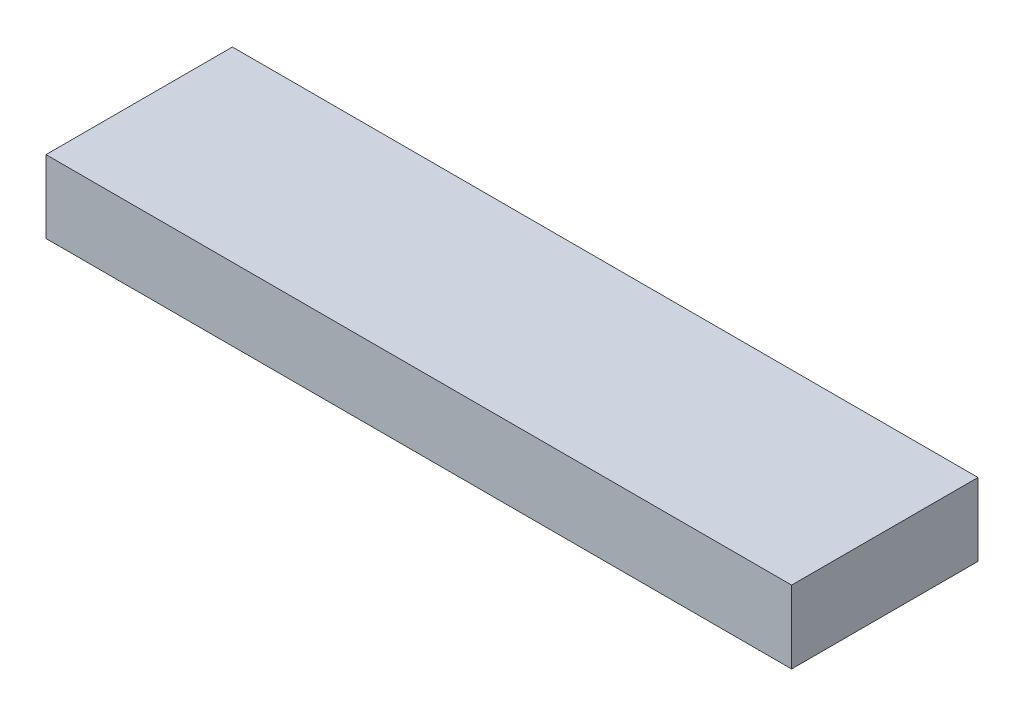
ISO-10303-21;
HEADER;
FILE_DESCRIPTION(('STEP AP214'),'2;1');
FILE_NAME('part.step','',(''),(''),'','','');
FILE_SCHEMA(('AUTOMOTIVE_DESIGN { 1 0 10303 214 1 1 1 1 }'));
ENDSEC;
DATA;
#1=APPLICATION_CONTEXT('core data for automotive mechanical design processes');
#2=APPLICATION_PROTOCOL_DEFINITION('international standard','automotive_design',2000,#1);
#3=PRODUCT_CONTEXT('',#1,'mechanical');
#4=PRODUCT('Part','Part','',(#3));
#5=PRODUCT_RELATED_PRODUCT_CATEGORY('part','',(#4));
#6=PRODUCT_DEFINITION_FORMATION('','',#4);
#7=PRODUCT_DEFINITION_CONTEXT('part definition',#1,'design');
#8=PRODUCT_DEFINITION('design','',#6,#7);
#9=PRODUCT_DEFINITION_SHAPE('','',#8);
#10=(LENGTH_UNIT() NAMED_UNIT(*) SI_UNIT(.MILLI.,.METRE.));
#11=(NAMED_UNIT(*) PLANE_ANGLE_UNIT() SI_UNIT($,.RADIAN.));
#12=(NAMED_UNIT(*) SI_UNIT($,.STERADIAN.) SOLID_ANGLE_UNIT());
#13=UNCERTAINTY_MEASURE_WITH_UNIT(LENGTH_MEASURE(1.E-05),#10,'distance_accuracy_value','');
#14=(GEOMETRIC_REPRESENTATION_CONTEXT(3) GLOBAL_UNCERTAINTY_ASSIGNED_CONTEXT((#13)) GLOBAL_UNIT_ASSIGNED_CONTEXT((#10,
#11,#12)) REPRESENTATION_CONTEXT('',''));
#15=CARTESIAN_POINT('',(0.,0.,0.));
#16=DIRECTION('',(0.,0.,1.));
#17=DIRECTION('',(1.,0.,0.));
#18=AXIS2_PLACEMENT_3D('',#15,#16,#17);
#19=CARTESIAN_POINT('',(-52.1227343115316,3.1,-15.1489720412826));
#20=DIRECTION('',(1.,0.,0.));
#21=DIRECTION('',(0.,0.,-1.));
#22=AXIS2_PLACEMENT_3D('',#19,#20,#21);
#23=PLANE('',#22);
#24=DIRECTION('',(0.,0.,1.));
#25=VECTOR('',#24,1.);
#26=CARTESIAN_POINT('',(-52.1227343115316,0.,-15.1489720412826));
#27=LINE('',#26,#25);
#28=CARTESIAN_POINT('',(-52.1227343115316,0.,-15.1489720412826));
#29=VERTEX_POINT('',#28);
#30=CARTESIAN_POINT('',(-52.1227343115316,0.,-7.19897204128258));
#31=VERTEX_POINT('',#30);
#32=EDGE_CURVE('E140',#29,#31,#27,.T.);
#33=ORIENTED_EDGE('',*,*,#32,.T.);
#34=DIRECTION('',(0.,-1.,0.));
#35=VECTOR('',#34,1.);
#36=CARTESIAN_POINT('',(-52.1227343115316,3.1,-7.19897204128258));
#37=LINE('',#36,#35);
#38=CARTESIAN_POINT('',(-52.1227343115316,3.1,-7.19897204128258));
#39=VERTEX_POINT('',#38);
#40=EDGE_CURVE('E11',#39,#31,#37,.T.);
#41=ORIENTED_EDGE('',*,*,#40,.F.);
#42=DIRECTION('',(0.,0.,1.));
#43=VECTOR('',#42,1.);
#44=CARTESIAN_POINT('',(-52.1227343115316,3.1,-15.1489720412826));
#45=LINE('',#44,#43);
#46=CARTESIAN_POINT('',(-52.1227343115316,3.1,-15.1489720412826));
#47=VERTEX_POINT('',#46);
#48=EDGE_CURVE('E144',#47,#39,#45,.T.);
#49=ORIENTED_EDGE('',*,*,#48,.F.);
#50=DIRECTION('',(0.,-1.,0.));
#51=VECTOR('',#50,1.);
#52=CARTESIAN_POINT('',(-52.1227343115316,3.1,-15.1489720412826));
#53=LINE('',#52,#51);
#54=EDGE_CURVE('E150',#47,#29,#53,.T.);
#55=ORIENTED_EDGE('',*,*,#54,.T.);
#56=EDGE_LOOP('',(#33,#41,#49,#55));
#57=FACE_BOUND('',#56,.T.);
#58=ADVANCED_FACE('F32',(#57),#23,.F.);
#59=CARTESIAN_POINT('',(-20.3227343115316,3.1,-7.19897204128259));
#60=DIRECTION('',(0.,0.,-1.));
#61=DIRECTION('',(-1.,0.,0.));
#62=AXIS2_PLACEMENT_3D('',#59,#60,#61);
#63=PLANE('',#62);
#64=DIRECTION('',(1.,0.,0.));
#65=VECTOR('',#64,1.);
#66=CARTESIAN_POINT('',(-20.3227343115316,0.,-7.19897204128259));
#67=LINE('',#66,#65);
#68=CARTESIAN_POINT('',(-20.3227343115316,0.,-7.19897204128259));
#69=VERTEX_POINT('',#68);
#70=EDGE_CURVE('E153',#31,#69,#67,.T.);
#71=ORIENTED_EDGE('',*,*,#70,.T.);
#72=DIRECTION('',(0.,-1.,0.));
#73=VECTOR('',#72,1.);
#74=CARTESIAN_POINT('',(-20.3227343115316,3.1,-7.19897204128259));
#75=LINE('',#74,#73);
#76=CARTESIAN_POINT('',(-20.3227343115316,3.1,-7.19897204128259));
#77=VERTEX_POINT('',#76);
#78=EDGE_CURVE('E39',#77,#69,#75,.T.);
#79=ORIENTED_EDGE('',*,*,#78,.F.);
#80=DIRECTION('',(1.,0.,0.));
#81=VECTOR('',#80,1.);
#82=CARTESIAN_POINT('',(-20.3227343115316,3.1,-7.19897204128259));
#83=LINE('',#82,#81);
#84=EDGE_CURVE('E83',#39,#77,#83,.T.);
#85=ORIENTED_EDGE('',*,*,#84,.F.);
#86=ORIENTED_EDGE('',*,*,#40,.T.);
#87=EDGE_LOOP('',(#71,#79,#85,#86));
#88=FACE_BOUND('',#87,.T.);
#89=ADVANCED_FACE('F181',(#88),#63,.F.);
#90=CARTESIAN_POINT('',(-20.3227343115316,3.1,-15.1489720412826));
#91=DIRECTION('',(-1.,0.,0.));
#92=DIRECTION('',(0.,0.,1.));
#93=AXIS2_PLACEMENT_3D('',#90,#91,#92);
#94=PLANE('',#93);
#95=DIRECTION('',(0.,0.,-1.));
#96=VECTOR('',#95,1.);
#97=CARTESIAN_POINT('',(-20.3227343115316,0.,-15.1489720412826));
#98=LINE('',#97,#96);
#99=CARTESIAN_POINT('',(-20.3227343115316,0.,-15.1489720412826));
#100=VERTEX_POINT('',#99);
#101=EDGE_CURVE('E155',#69,#100,#98,.T.);
#102=ORIENTED_EDGE('',*,*,#101,.T.);
#103=DIRECTION('',(0.,-1.,0.));
#104=VECTOR('',#103,1.);
#105=CARTESIAN_POINT('',(-20.3227343115316,3.1,-15.1489720412826));
#106=LINE('',#105,#104);
#107=CARTESIAN_POINT('',(-20.3227343115316,3.1,-15.1489720412826));
#108=VERTEX_POINT('',#107);
#109=EDGE_CURVE('E159',#108,#100,#106,.T.);
#110=ORIENTED_EDGE('',*,*,#109,.F.);
#111=DIRECTION('',(0.,0.,-1.));
#112=VECTOR('',#111,1.);
#113=CARTESIAN_POINT('',(-20.3227343115316,3.1,-15.1489720412826));
#114=LINE('',#113,#112);
#115=EDGE_CURVE('E147',#77,#108,#114,.T.);
#116=ORIENTED_EDGE('',*,*,#115,.F.);
#117=ORIENTED_EDGE('',*,*,#78,.T.);
#118=EDGE_LOOP('',(#102,#110,#116,#117));
#119=FACE_BOUND('',#118,.T.);
#120=ADVANCED_FACE('F164',(#119),#94,.F.);
#121=CARTESIAN_POINT('',(-52.1227343115316,3.1,-15.1489720412826));
#122=DIRECTION('',(0.,0.,1.));
#123=DIRECTION('',(1.,0.,0.));
#124=AXIS2_PLACEMENT_3D('',#121,#122,#123);
#125=PLANE('',#124);
#126=DIRECTION('',(-1.,0.,0.));
#127=VECTOR('',#126,1.);
#128=CARTESIAN_POINT('',(-52.1227343115316,0.,-15.1489720412826));
#129=LINE('',#128,#127);
#130=EDGE_CURVE('E76',#100,#29,#129,.T.);
#131=ORIENTED_EDGE('',*,*,#130,.T.);
#132=ORIENTED_EDGE('',*,*,#54,.F.);
#133=DIRECTION('',(-1.,0.,0.));
#134=VECTOR('',#133,1.);
#135=CARTESIAN_POINT('',(-52.1227343115316,3.1,-15.1489720412826));
#136=LINE('',#135,#134);
#137=EDGE_CURVE('E55',#108,#47,#136,.T.);
#138=ORIENTED_EDGE('',*,*,#137,.F.);
#139=ORIENTED_EDGE('',*,*,#109,.T.);
#140=EDGE_LOOP('',(#131,#132,#138,#139));
#141=FACE_BOUND('',#140,.T.);
#142=ADVANCED_FACE('F172',(#141),#125,.F.);
#143=CARTESIAN_POINT('',(-52.1227343115316,3.1,-7.19897204128258));
#144=DIRECTION('',(0.,-1.,0.));
#145=DIRECTION('',(0.,0.,-1.));
#146=AXIS2_PLACEMENT_3D('',#143,#144,#145);
#147=PLANE('',#146);
#148=ORIENTED_EDGE('',*,*,#48,.T.);
#149=ORIENTED_EDGE('',*,*,#84,.T.);
#150=ORIENTED_EDGE('',*,*,#115,.T.);
#151=ORIENTED_EDGE('',*,*,#137,.T.);
#152=EDGE_LOOP('',(#148,#149,#150,#151));
#153=FACE_BOUND('',#152,.T.);
#154=ADVANCED_FACE('F174',(#153),#147,.F.);
#155=CARTESIAN_POINT('',(-52.1227343115316,0.,-7.19897204128258));
#156=DIRECTION('',(0.,-1.,0.));
#157=DIRECTION('',(0.,0.,-1.));
#158=AXIS2_PLACEMENT_3D('',#155,#156,#157);
#159=PLANE('',#158);
#160=DIRECTION('',(0.,0.,-1.));
#161=VECTOR('',#160,1.);
#162=CARTESIAN_POINT('',(-50.6227343115316,0.,-13.6489720412826));
#163=LINE('',#162,#161);
#164=CARTESIAN_POINT('',(-50.6227343115316,0.,-8.69897204128258));
#165=VERTEX_POINT('',#164);
#166=CARTESIAN_POINT('',(-50.6227343115316,0.,-13.6489720412826));
#167=VERTEX_POINT('',#166);
#168=EDGE_CURVE('E46',#165,#167,#163,.T.);
#169=ORIENTED_EDGE('',*,*,#168,.F.);
#170=DIRECTION('',(-1.,0.,0.));
#171=VECTOR('',#170,1.);
#172=CARTESIAN_POINT('',(-50.6227343115316,0.,-8.69897204128258));
#173=LINE('',#172,#171);
#174=CARTESIAN_POINT('',(-21.8227343115316,0.,-8.69897204128258));
#175=VERTEX_POINT('',#174);
#176=EDGE_CURVE('E125',#175,#165,#173,.T.);
#177=ORIENTED_EDGE('',*,*,#176,.F.);
#178=DIRECTION('',(0.,0.,1.));
#179=VECTOR('',#178,1.);
#180=CARTESIAN_POINT('',(-21.8227343115316,0.,-8.69897204128258));
#181=LINE('',#180,#179);
#182=CARTESIAN_POINT('',(-21.8227343115316,0.,-13.6489720412826));
#183=VERTEX_POINT('',#182);
#184=EDGE_CURVE('E128',#183,#175,#181,.T.);
#185=ORIENTED_EDGE('',*,*,#184,.F.);
#186=DIRECTION('',(1.,0.,0.));
#187=VECTOR('',#186,1.);
#188=CARTESIAN_POINT('',(-21.8227343115316,0.,-13.6489720412826));
#189=LINE('',#188,#187);
#190=EDGE_CURVE('E134',#167,#183,#189,.T.);
#191=ORIENTED_EDGE('',*,*,#190,.F.);
#192=EDGE_LOOP('',(#169,#177,#185,#191));
#193=FACE_BOUND('',#192,.T.);
#194=ORIENTED_EDGE('',*,*,#32,.F.);
#195=ORIENTED_EDGE('',*,*,#130,.F.);
#196=ORIENTED_EDGE('',*,*,#101,.F.);
#197=ORIENTED_EDGE('',*,*,#70,.F.);
#198=EDGE_LOOP('',(#194,#195,#196,#197));
#199=FACE_BOUND('',#198,.T.);
#200=ADVANCED_FACE('F168',(#193,#199),#159,.T.);
#201=CARTESIAN_POINT('',(-50.6227343115316,2.,-13.6489720412826));
#202=DIRECTION('',(-1.,0.,0.));
#203=DIRECTION('',(0.,0.,1.));
#204=AXIS2_PLACEMENT_3D('',#201,#202,#203);
#205=PLANE('',#204);
#206=ORIENTED_EDGE('',*,*,#168,.T.);
#207=DIRECTION('',(0.,-1.,0.));
#208=VECTOR('',#207,1.);
#209=CARTESIAN_POINT('',(-50.6227343115316,2.,-13.6489720412826));
#210=LINE('',#209,#208);
#211=CARTESIAN_POINT('',(-50.6227343115316,2.,-13.6489720412826));
#212=VERTEX_POINT('',#211);
#213=EDGE_CURVE('E103',#212,#167,#210,.T.);
#214=ORIENTED_EDGE('',*,*,#213,.F.);
#215=DIRECTION('',(0.,0.,-1.));
#216=VECTOR('',#215,1.);
#217=CARTESIAN_POINT('',(-50.6227343115316,2.,-13.6489720412826));
#218=LINE('',#217,#216);
#219=CARTESIAN_POINT('',(-50.6227343115316,2.,-8.69897204128258));
#220=VERTEX_POINT('',#219);
#221=EDGE_CURVE('E107',#220,#212,#218,.T.);
#222=ORIENTED_EDGE('',*,*,#221,.F.);
#223=DIRECTION('',(0.,-1.,0.));
#224=VECTOR('',#223,1.);
#225=CARTESIAN_POINT('',(-50.6227343115316,2.,-8.69897204128258));
#226=LINE('',#225,#224);
#227=EDGE_CURVE('E138',#220,#165,#226,.T.);
#228=ORIENTED_EDGE('',*,*,#227,.T.);
#229=EDGE_LOOP('',(#206,#214,#222,#228));
#230=FACE_BOUND('',#229,.T.);
#231=ADVANCED_FACE('F105',(#230),#205,.F.);
#232=CARTESIAN_POINT('',(-50.6227343115316,2.,-8.69897204128258));
#233=DIRECTION('',(0.,0.,1.));
#234=DIRECTION('',(1.,0.,0.));
#235=AXIS2_PLACEMENT_3D('',#232,#233,#234);
#236=PLANE('',#235);
#237=ORIENTED_EDGE('',*,*,#176,.T.);
#238=ORIENTED_EDGE('',*,*,#227,.F.);
#239=DIRECTION('',(-1.,0.,0.));
#240=VECTOR('',#239,1.);
#241=CARTESIAN_POINT('',(-50.6227343115316,2.,-8.69897204128258));
#242=LINE('',#241,#240);
#243=CARTESIAN_POINT('',(-21.8227343115316,2.,-8.69897204128258));
#244=VERTEX_POINT('',#243);
#245=EDGE_CURVE('E113',#244,#220,#242,.T.);
#246=ORIENTED_EDGE('',*,*,#245,.F.);
#247=DIRECTION('',(0.,-1.,0.));
#248=VECTOR('',#247,1.);
#249=CARTESIAN_POINT('',(-21.8227343115316,2.,-8.69897204128258));
#250=LINE('',#249,#248);
#251=EDGE_CURVE('E141',#244,#175,#250,.T.);
#252=ORIENTED_EDGE('',*,*,#251,.T.);
#253=EDGE_LOOP('',(#237,#238,#246,#252));
#254=FACE_BOUND('',#253,.T.);
#255=ADVANCED_FACE('F221',(#254),#236,.F.);
#256=CARTESIAN_POINT('',(-21.8227343115316,2.,-8.69897204128258));
#257=DIRECTION('',(1.,0.,0.));
#258=DIRECTION('',(0.,0.,-1.));
#259=AXIS2_PLACEMENT_3D('',#256,#257,#258);
#260=PLANE('',#259);
#261=ORIENTED_EDGE('',*,*,#184,.T.);
#262=ORIENTED_EDGE('',*,*,#251,.F.);
#263=DIRECTION('',(0.,0.,1.));
#264=VECTOR('',#263,1.);
#265=CARTESIAN_POINT('',(-21.8227343115316,2.,-8.69897204128258));
#266=LINE('',#265,#264);
#267=CARTESIAN_POINT('',(-21.8227343115316,2.,-13.6489720412826));
#268=VERTEX_POINT('',#267);
#269=EDGE_CURVE('E121',#268,#244,#266,.T.);
#270=ORIENTED_EDGE('',*,*,#269,.F.);
#271=DIRECTION('',(0.,-1.,0.));
#272=VECTOR('',#271,1.);
#273=CARTESIAN_POINT('',(-21.8227343115316,2.,-13.6489720412826));
#274=LINE('',#273,#272);
#275=EDGE_CURVE('E112',#268,#183,#274,.T.);
#276=ORIENTED_EDGE('',*,*,#275,.T.);
#277=EDGE_LOOP('',(#261,#262,#270,#276));
#278=FACE_BOUND('',#277,.T.);
#279=ADVANCED_FACE('F230',(#278),#260,.F.);
#280=CARTESIAN_POINT('',(-21.8227343115316,2.,-13.6489720412826));
#281=DIRECTION('',(0.,0.,-1.));
#282=DIRECTION('',(-1.,0.,0.));
#283=AXIS2_PLACEMENT_3D('',#280,#281,#282);
#284=PLANE('',#283);
#285=ORIENTED_EDGE('',*,*,#190,.T.);
#286=ORIENTED_EDGE('',*,*,#275,.F.);
#287=DIRECTION('',(1.,0.,0.));
#288=VECTOR('',#287,1.);
#289=CARTESIAN_POINT('',(-21.8227343115316,2.,-13.6489720412826));
#290=LINE('',#289,#288);
#291=EDGE_CURVE('E116',#212,#268,#290,.T.);
#292=ORIENTED_EDGE('',*,*,#291,.F.);
#293=ORIENTED_EDGE('',*,*,#213,.T.);
#294=EDGE_LOOP('',(#285,#286,#292,#293));
#295=FACE_BOUND('',#294,.T.);
#296=ADVANCED_FACE('F117',(#295),#284,.F.);
#297=CARTESIAN_POINT('',(-50.6227343115316,2.,-8.69897204128258));
#298=DIRECTION('',(0.,1.,0.));
#299=DIRECTION('',(0.,0.,1.));
#300=AXIS2_PLACEMENT_3D('',#297,#298,#299);
#301=PLANE('',#300);
#302=ORIENTED_EDGE('',*,*,#221,.T.);
#303=ORIENTED_EDGE('',*,*,#291,.T.);
#304=ORIENTED_EDGE('',*,*,#269,.T.);
#305=ORIENTED_EDGE('',*,*,#245,.T.);
#306=EDGE_LOOP('',(#302,#303,#304,#305));
#307=FACE_BOUND('',#306,.T.);
#308=ADVANCED_FACE('F123',(#307),#301,.F.);
#309=CLOSED_SHELL('',(#58,#89,#120,#142,#154,#200,#231,#255,#279,#296,#308));
#310=MANIFOLD_SOLID_BREP('B2',#309);
#311=ADVANCED_BREP_SHAPE_REPRESENTATION('',(#18,#310),#14);
#312=SHAPE_DEFINITION_REPRESENTATION(#9,#311);
ENDSEC;
END-ISO-10303-21;
